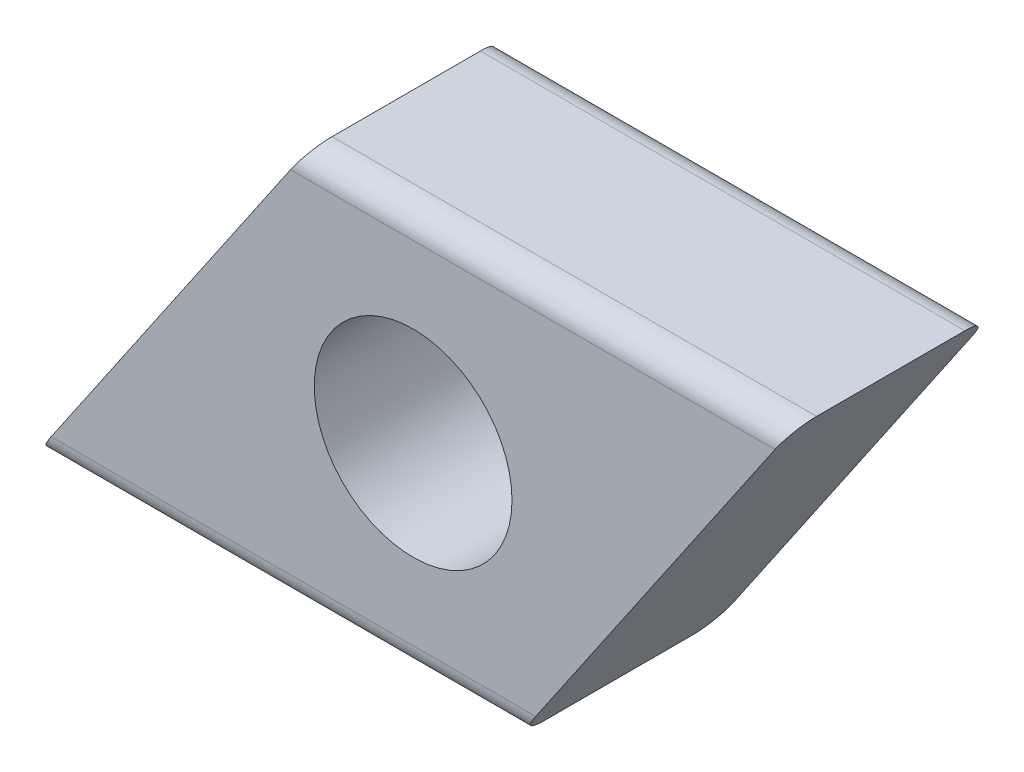
ISO-10303-21;
HEADER;
FILE_DESCRIPTION(('STEP AP214'),'2;1');
FILE_NAME('part.step','',(''),(''),'','','');
FILE_SCHEMA(('AUTOMOTIVE_DESIGN { 1 0 10303 214 1 1 1 1 }'));
ENDSEC;
DATA;
#1=APPLICATION_CONTEXT('core data for automotive mechanical design processes');
#2=APPLICATION_PROTOCOL_DEFINITION('international standard','automotive_design',2000,#1);
#3=PRODUCT_CONTEXT('',#1,'mechanical');
#4=PRODUCT('Part','Part','',(#3));
#5=PRODUCT_RELATED_PRODUCT_CATEGORY('part','',(#4));
#6=PRODUCT_DEFINITION_FORMATION('','',#4);
#7=PRODUCT_DEFINITION_CONTEXT('part definition',#1,'design');
#8=PRODUCT_DEFINITION('design','',#6,#7);
#9=PRODUCT_DEFINITION_SHAPE('','',#8);
#10=(LENGTH_UNIT() NAMED_UNIT(*) SI_UNIT(.MILLI.,.METRE.));
#11=(NAMED_UNIT(*) PLANE_ANGLE_UNIT() SI_UNIT($,.RADIAN.));
#12=(NAMED_UNIT(*) SI_UNIT($,.STERADIAN.) SOLID_ANGLE_UNIT());
#13=UNCERTAINTY_MEASURE_WITH_UNIT(LENGTH_MEASURE(1.E-05),#10,'distance_accuracy_value','');
#14=(GEOMETRIC_REPRESENTATION_CONTEXT(3) GLOBAL_UNCERTAINTY_ASSIGNED_CONTEXT((#13)) GLOBAL_UNIT_ASSIGNED_CONTEXT((#10,
#11,#12)) REPRESENTATION_CONTEXT('',''));
#15=CARTESIAN_POINT('',(0.,0.,0.));
#16=DIRECTION('',(0.,0.,1.));
#17=DIRECTION('',(1.,0.,0.));
#18=AXIS2_PLACEMENT_3D('',#15,#16,#17);
#19=CARTESIAN_POINT('',(0.,0.,4.));
#20=DIRECTION('',(0.826146788634578,-0.563454952617132,0.));
#21=DIRECTION('',(0.563454952617132,0.826146788634578,0.));
#22=AXIS2_PLACEMENT_3D('',#19,#20,#21);
#23=PLANE('',#22);
#24=DIRECTION('',(0.,0.,-1.));
#25=VECTOR('',#24,1.);
#26=CARTESIAN_POINT('',(5.52185853564789,8.09623852861886,4.));
#27=LINE('',#26,#25);
#28=CARTESIAN_POINT('',(5.52185853564789,8.09623852861886,3.5));
#29=VERTEX_POINT('',#28);
#30=CARTESIAN_POINT('',(5.52185853564789,8.09623852861886,0.5));
#31=VERTEX_POINT('',#30);
#32=EDGE_CURVE('E99',#29,#31,#27,.T.);
#33=ORIENTED_EDGE('',*,*,#32,.T.);
#34=CARTESIAN_POINT('',(5.1808447107631,7.59623852861886,0.5));
#35=DIRECTION('',(0.826146788634578,-0.563454952617132,0.));
#36=DIRECTION('',(0.563454952617132,0.826146788634578,0.));
#37=AXIS2_PLACEMENT_3D('',#34,#35,#36);
#38=ELLIPSE('',#37,0.605219322859537,0.5);
#39=CARTESIAN_POINT('',(5.1808447107631,7.59623852861886,0.));
#40=VERTEX_POINT('',#39);
#41=EDGE_CURVE('E106',#31,#40,#38,.F.);
#42=ORIENTED_EDGE('',*,*,#41,.T.);
#43=DIRECTION('',(-0.563454952617132,-0.826146788634578,0.));
#44=VECTOR('',#43,1.);
#45=CARTESIAN_POINT('',(0.,0.,0.));
#46=LINE('',#45,#44);
#47=CARTESIAN_POINT('',(0.341013824884793,0.5,0.));
#48=VERTEX_POINT('',#47);
#49=EDGE_CURVE('E167',#40,#48,#46,.T.);
#50=ORIENTED_EDGE('',*,*,#49,.T.);
#51=CARTESIAN_POINT('',(0.341013824884793,0.5,0.5));
#52=DIRECTION('',(0.826146788634578,-0.563454952617132,0.));
#53=DIRECTION('',(-0.563454952617132,-0.826146788634578,0.));
#54=AXIS2_PLACEMENT_3D('',#51,#52,#53);
#55=ELLIPSE('',#54,0.605219322859537,0.5);
#56=CARTESIAN_POINT('',(0.,0.,0.5));
#57=VERTEX_POINT('',#56);
#58=EDGE_CURVE('E107',#48,#57,#55,.F.);
#59=ORIENTED_EDGE('',*,*,#58,.T.);
#60=DIRECTION('',(0.,0.,-1.));
#61=VECTOR('',#60,1.);
#62=CARTESIAN_POINT('',(0.,0.,4.));
#63=LINE('',#62,#61);
#64=CARTESIAN_POINT('',(0.,0.,3.5));
#65=VERTEX_POINT('',#64);
#66=EDGE_CURVE('E123',#65,#57,#63,.T.);
#67=ORIENTED_EDGE('',*,*,#66,.F.);
#68=CARTESIAN_POINT('',(0.341013824884794,0.5,3.5));
#69=DIRECTION('',(0.826146788634578,-0.563454952617132,0.));
#70=DIRECTION('',(0.563454952617132,0.826146788634578,0.));
#71=AXIS2_PLACEMENT_3D('',#68,#69,#70);
#72=ELLIPSE('',#71,0.605219322859537,0.5);
#73=CARTESIAN_POINT('',(0.341013824884793,0.500000000000001,4.));
#74=VERTEX_POINT('',#73);
#75=EDGE_CURVE('E125',#65,#74,#72,.F.);
#76=ORIENTED_EDGE('',*,*,#75,.T.);
#77=DIRECTION('',(-0.563454952617132,-0.826146788634578,0.));
#78=VECTOR('',#77,1.);
#79=CARTESIAN_POINT('',(0.,0.,4.));
#80=LINE('',#79,#78);
#81=CARTESIAN_POINT('',(5.1808447107631,7.59623852861886,4.));
#82=VERTEX_POINT('',#81);
#83=EDGE_CURVE('E101',#82,#74,#80,.T.);
#84=ORIENTED_EDGE('',*,*,#83,.F.);
#85=CARTESIAN_POINT('',(5.1808447107631,7.59623852861886,3.5));
#86=DIRECTION('',(0.826146788634578,-0.563454952617132,0.));
#87=DIRECTION('',(-0.563454952617132,-0.826146788634578,0.));
#88=AXIS2_PLACEMENT_3D('',#85,#86,#87);
#89=ELLIPSE('',#88,0.605219322859537,0.5);
#90=EDGE_CURVE('E97',#82,#29,#89,.F.);
#91=ORIENTED_EDGE('',*,*,#90,.T.);
#92=EDGE_LOOP('',(#33,#42,#50,#59,#67,#76,#84,#91));
#93=FACE_BOUND('',#92,.T.);
#94=ADVANCED_FACE('F31',(#93),#23,.F.);
#95=CARTESIAN_POINT('',(0.,0.,4.));
#96=DIRECTION('',(0.,1.,0.));
#97=DIRECTION('',(0.,0.,1.));
#98=AXIS2_PLACEMENT_3D('',#95,#96,#97);
#99=PLANE('',#98);
#100=ORIENTED_EDGE('',*,*,#66,.T.);
#101=DIRECTION('',(1.,0.,0.));
#102=VECTOR('',#101,1.);
#103=CARTESIAN_POINT('',(9.8,0.,0.5));
#104=LINE('',#103,#102);
#105=CARTESIAN_POINT('',(9.8,0.,0.5));
#106=VERTEX_POINT('',#105);
#107=EDGE_CURVE('E11',#57,#106,#104,.T.);
#108=ORIENTED_EDGE('',*,*,#107,.T.);
#109=DIRECTION('',(0.,0.,-1.));
#110=VECTOR('',#109,1.);
#111=CARTESIAN_POINT('',(9.8,0.,4.));
#112=LINE('',#111,#110);
#113=CARTESIAN_POINT('',(9.8,0.,3.5));
#114=VERTEX_POINT('',#113);
#115=EDGE_CURVE('E128',#114,#106,#112,.T.);
#116=ORIENTED_EDGE('',*,*,#115,.F.);
#117=DIRECTION('',(1.,0.,0.));
#118=VECTOR('',#117,1.);
#119=CARTESIAN_POINT('',(0.,0.,3.5));
#120=LINE('',#119,#118);
#121=EDGE_CURVE('E39',#114,#65,#120,.F.);
#122=ORIENTED_EDGE('',*,*,#121,.T.);
#123=EDGE_LOOP('',(#100,#108,#116,#122));
#124=FACE_BOUND('',#123,.T.);
#125=ADVANCED_FACE('F151',(#124),#99,.F.);
#126=CARTESIAN_POINT('',(9.8,0.,4.));
#127=DIRECTION('',(-0.826146788634578,0.563454952617132,0.));
#128=DIRECTION('',(-0.563454952617132,-0.826146788634578,0.));
#129=AXIS2_PLACEMENT_3D('',#126,#127,#128);
#130=PLANE('',#129);
#131=DIRECTION('',(0.563454952617132,0.826146788634578,0.));
#132=VECTOR('',#131,1.);
#133=CARTESIAN_POINT('',(9.8,0.,0.));
#134=LINE('',#133,#132);
#135=CARTESIAN_POINT('',(10.1410138248848,0.5,0.));
#136=VERTEX_POINT('',#135);
#137=CARTESIAN_POINT('',(14.9808447107631,7.59623852861886,0.));
#138=VERTEX_POINT('',#137);
#139=EDGE_CURVE('E163',#136,#138,#134,.T.);
#140=ORIENTED_EDGE('',*,*,#139,.T.);
#141=CARTESIAN_POINT('',(14.9808447107631,7.59623852861886,0.5));
#142=DIRECTION('',(-0.826146788634578,0.563454952617132,0.));
#143=DIRECTION('',(0.563454952617132,0.826146788634578,0.));
#144=AXIS2_PLACEMENT_3D('',#141,#142,#143);
#145=ELLIPSE('',#144,0.605219322859537,0.5);
#146=CARTESIAN_POINT('',(15.3218585356479,8.09623852861886,0.5));
#147=VERTEX_POINT('',#146);
#148=EDGE_CURVE('E142',#138,#147,#145,.F.);
#149=ORIENTED_EDGE('',*,*,#148,.T.);
#150=DIRECTION('',(0.,0.,-1.));
#151=VECTOR('',#150,1.);
#152=CARTESIAN_POINT('',(15.3218585356479,8.09623852861886,4.));
#153=LINE('',#152,#151);
#154=CARTESIAN_POINT('',(15.3218585356479,8.09623852861886,3.5));
#155=VERTEX_POINT('',#154);
#156=EDGE_CURVE('E117',#155,#147,#153,.T.);
#157=ORIENTED_EDGE('',*,*,#156,.F.);
#158=CARTESIAN_POINT('',(14.9808447107631,7.59623852861886,3.5));
#159=DIRECTION('',(-0.826146788634578,0.563454952617132,0.));
#160=DIRECTION('',(-0.563454952617132,-0.826146788634578,0.));
#161=AXIS2_PLACEMENT_3D('',#158,#159,#160);
#162=ELLIPSE('',#161,0.605219322859537,0.5);
#163=CARTESIAN_POINT('',(14.9808447107631,7.59623852861886,4.));
#164=VERTEX_POINT('',#163);
#165=EDGE_CURVE('E122',#155,#164,#162,.F.);
#166=ORIENTED_EDGE('',*,*,#165,.T.);
#167=DIRECTION('',(0.563454952617132,0.826146788634578,0.));
#168=VECTOR('',#167,1.);
#169=CARTESIAN_POINT('',(9.8,0.,4.));
#170=LINE('',#169,#168);
#171=CARTESIAN_POINT('',(10.1410138248848,0.500000000000001,4.));
#172=VERTEX_POINT('',#171);
#173=EDGE_CURVE('E118',#172,#164,#170,.T.);
#174=ORIENTED_EDGE('',*,*,#173,.F.);
#175=CARTESIAN_POINT('',(10.1410138248848,0.5,3.5));
#176=DIRECTION('',(-0.826146788634578,0.563454952617132,0.));
#177=DIRECTION('',(0.563454952617132,0.826146788634578,0.));
#178=AXIS2_PLACEMENT_3D('',#175,#176,#177);
#179=ELLIPSE('',#178,0.605219322859537,0.5);
#180=EDGE_CURVE('E53',#172,#114,#179,.F.);
#181=ORIENTED_EDGE('',*,*,#180,.T.);
#182=ORIENTED_EDGE('',*,*,#115,.T.);
#183=CARTESIAN_POINT('',(10.1410138248848,0.5,0.5));
#184=DIRECTION('',(-0.826146788634578,0.563454952617132,0.));
#185=DIRECTION('',(-0.563454952617132,-0.826146788634578,0.));
#186=AXIS2_PLACEMENT_3D('',#183,#184,#185);
#187=ELLIPSE('',#186,0.605219322859537,0.5);
#188=EDGE_CURVE('E46',#106,#136,#187,.F.);
#189=ORIENTED_EDGE('',*,*,#188,.T.);
#190=EDGE_LOOP('',(#140,#149,#157,#166,#174,#181,#182,#189));
#191=FACE_BOUND('',#190,.T.);
#192=ADVANCED_FACE('F161',(#191),#130,.F.);
#193=CARTESIAN_POINT('',(5.52185853564789,8.09623852861886,4.));
#194=DIRECTION('',(0.,-1.,0.));
#195=DIRECTION('',(0.,0.,-1.));
#196=AXIS2_PLACEMENT_3D('',#193,#194,#195);
#197=PLANE('',#196);
#198=ORIENTED_EDGE('',*,*,#156,.T.);
#199=DIRECTION('',(-1.,0.,0.));
#200=VECTOR('',#199,1.);
#201=CARTESIAN_POINT('',(5.52185853564789,8.09623852861886,0.5));
#202=LINE('',#201,#200);
#203=EDGE_CURVE('E116',#147,#31,#202,.T.);
#204=ORIENTED_EDGE('',*,*,#203,.T.);
#205=ORIENTED_EDGE('',*,*,#32,.F.);
#206=DIRECTION('',(-1.,0.,0.));
#207=VECTOR('',#206,1.);
#208=CARTESIAN_POINT('',(5.52185853564789,8.09623852861886,3.5));
#209=LINE('',#208,#207);
#210=EDGE_CURVE('E113',#29,#155,#209,.F.);
#211=ORIENTED_EDGE('',*,*,#210,.T.);
#212=EDGE_LOOP('',(#198,#204,#205,#211));
#213=FACE_BOUND('',#212,.T.);
#214=ADVANCED_FACE('F112',(#213),#197,.F.);
#215=CARTESIAN_POINT('',(5.52185853564789,8.09623852861886,4.));
#216=DIRECTION('',(0.,0.,-1.));
#217=DIRECTION('',(-1.,0.,0.));
#218=AXIS2_PLACEMENT_3D('',#215,#216,#217);
#219=PLANE('',#218);
#220=CARTESIAN_POINT('',(7.66092926782395,4.04811926430943,4.));
#221=DIRECTION('',(0.,0.,1.));
#222=DIRECTION('',(1.,0.,0.));
#223=AXIS2_PLACEMENT_3D('',#220,#221,#222);
#224=CIRCLE('',#223,2.);
#225=CARTESIAN_POINT('',(9.66092926782395,4.04811926430943,4.));
#226=VERTEX_POINT('',#225);
#227=EDGE_CURVE('E274',#226,#226,#224,.T.);
#228=ORIENTED_EDGE('',*,*,#227,.F.);
#229=EDGE_LOOP('',(#228));
#230=FACE_BOUND('',#229,.T.);
#231=ORIENTED_EDGE('',*,*,#173,.T.);
#232=DIRECTION('',(-1.,0.,0.));
#233=VECTOR('',#232,1.);
#234=CARTESIAN_POINT('',(5.52185853564789,7.59623852861886,4.));
#235=LINE('',#234,#233);
#236=EDGE_CURVE('E147',#164,#82,#235,.T.);
#237=ORIENTED_EDGE('',*,*,#236,.T.);
#238=ORIENTED_EDGE('',*,*,#83,.T.);
#239=DIRECTION('',(1.,0.,0.));
#240=VECTOR('',#239,1.);
#241=CARTESIAN_POINT('',(5.52185853564789,0.5,4.));
#242=LINE('',#241,#240);
#243=EDGE_CURVE('E144',#74,#172,#242,.T.);
#244=ORIENTED_EDGE('',*,*,#243,.T.);
#245=EDGE_LOOP('',(#231,#237,#238,#244));
#246=FACE_BOUND('',#245,.T.);
#247=ADVANCED_FACE('F159',(#230,#246),#219,.F.);
#248=CARTESIAN_POINT('',(5.52185853564789,8.09623852861886,0.));
#249=DIRECTION('',(0.,0.,-1.));
#250=DIRECTION('',(-1.,0.,0.));
#251=AXIS2_PLACEMENT_3D('',#248,#249,#250);
#252=PLANE('',#251);
#253=CARTESIAN_POINT('',(7.66092926782395,4.04811926430943,0.));
#254=DIRECTION('',(0.,0.,1.));
#255=DIRECTION('',(1.,0.,0.));
#256=AXIS2_PLACEMENT_3D('',#253,#254,#255);
#257=CIRCLE('',#256,2.);
#258=CARTESIAN_POINT('',(9.66092926782395,4.04811926430943,0.));
#259=VERTEX_POINT('',#258);
#260=EDGE_CURVE('E169',#259,#259,#257,.T.);
#261=ORIENTED_EDGE('',*,*,#260,.T.);
#262=EDGE_LOOP('',(#261));
#263=FACE_BOUND('',#262,.T.);
#264=ORIENTED_EDGE('',*,*,#49,.F.);
#265=DIRECTION('',(-1.,0.,0.));
#266=VECTOR('',#265,1.);
#267=CARTESIAN_POINT('',(15.3218585356479,7.59623852861886,0.));
#268=LINE('',#267,#266);
#269=EDGE_CURVE('E137',#40,#138,#268,.F.);
#270=ORIENTED_EDGE('',*,*,#269,.T.);
#271=ORIENTED_EDGE('',*,*,#139,.F.);
#272=DIRECTION('',(1.,0.,0.));
#273=VECTOR('',#272,1.);
#274=CARTESIAN_POINT('',(0.,0.5,0.));
#275=LINE('',#274,#273);
#276=EDGE_CURVE('E135',#136,#48,#275,.F.);
#277=ORIENTED_EDGE('',*,*,#276,.T.);
#278=EDGE_LOOP('',(#264,#270,#271,#277));
#279=FACE_BOUND('',#278,.T.);
#280=ADVANCED_FACE('F175',(#263,#279),#252,.T.);
#281=CARTESIAN_POINT('',(7.66092926782395,4.04811926430943,0.));
#282=DIRECTION('',(0.,0.,1.));
#283=DIRECTION('',(1.,0.,0.));
#284=AXIS2_PLACEMENT_3D('',#281,#282,#283);
#285=CYLINDRICAL_SURFACE('',#284,2.);
#286=ORIENTED_EDGE('',*,*,#260,.F.);
#287=EDGE_LOOP('',(#286));
#288=FACE_BOUND('',#287,.T.);
#289=ORIENTED_EDGE('',*,*,#227,.T.);
#290=EDGE_LOOP('',(#289));
#291=FACE_BOUND('',#290,.T.);
#292=ADVANCED_FACE('F194',(#288,#291),#285,.F.);
#293=CARTESIAN_POINT('',(5.52185853564789,7.59623852861886,0.5));
#294=DIRECTION('',(1.,0.,0.));
#295=DIRECTION('',(0.,0.,-1.));
#296=AXIS2_PLACEMENT_3D('',#293,#294,#295);
#297=CYLINDRICAL_SURFACE('',#296,0.5);
#298=ORIENTED_EDGE('',*,*,#148,.F.);
#299=ORIENTED_EDGE('',*,*,#269,.F.);
#300=ORIENTED_EDGE('',*,*,#41,.F.);
#301=ORIENTED_EDGE('',*,*,#203,.F.);
#302=EDGE_LOOP('',(#298,#299,#300,#301));
#303=FACE_BOUND('',#302,.T.);
#304=ADVANCED_FACE('F183',(#303),#297,.T.);
#305=CARTESIAN_POINT('',(5.52185853564789,7.59623852861886,3.5));
#306=DIRECTION('',(-1.,0.,0.));
#307=DIRECTION('',(0.,0.,1.));
#308=AXIS2_PLACEMENT_3D('',#305,#306,#307);
#309=CYLINDRICAL_SURFACE('',#308,0.5);
#310=ORIENTED_EDGE('',*,*,#165,.F.);
#311=ORIENTED_EDGE('',*,*,#210,.F.);
#312=ORIENTED_EDGE('',*,*,#90,.F.);
#313=ORIENTED_EDGE('',*,*,#236,.F.);
#314=EDGE_LOOP('',(#310,#311,#312,#313));
#315=FACE_BOUND('',#314,.T.);
#316=ADVANCED_FACE('F121',(#315),#309,.T.);
#317=CARTESIAN_POINT('',(0.,0.5,0.5));
#318=DIRECTION('',(-1.,0.,0.));
#319=DIRECTION('',(0.,0.,1.));
#320=AXIS2_PLACEMENT_3D('',#317,#318,#319);
#321=CYLINDRICAL_SURFACE('',#320,0.5);
#322=ORIENTED_EDGE('',*,*,#58,.F.);
#323=ORIENTED_EDGE('',*,*,#276,.F.);
#324=ORIENTED_EDGE('',*,*,#188,.F.);
#325=ORIENTED_EDGE('',*,*,#107,.F.);
#326=EDGE_LOOP('',(#322,#323,#324,#325));
#327=FACE_BOUND('',#326,.T.);
#328=ADVANCED_FACE('F177',(#327),#321,.T.);
#329=CARTESIAN_POINT('',(5.52185853564789,0.5,3.5));
#330=DIRECTION('',(1.,0.,0.));
#331=DIRECTION('',(0.,0.,-1.));
#332=AXIS2_PLACEMENT_3D('',#329,#330,#331);
#333=CYLINDRICAL_SURFACE('',#332,0.5);
#334=ORIENTED_EDGE('',*,*,#75,.F.);
#335=ORIENTED_EDGE('',*,*,#121,.F.);
#336=ORIENTED_EDGE('',*,*,#180,.F.);
#337=ORIENTED_EDGE('',*,*,#243,.F.);
#338=EDGE_LOOP('',(#334,#335,#336,#337));
#339=FACE_BOUND('',#338,.T.);
#340=ADVANCED_FACE('F33',(#339),#333,.T.);
#341=CLOSED_SHELL('',(#94,#125,#192,#214,#247,#280,#292,#304,#316,#328,#340));
#342=MANIFOLD_SOLID_BREP('B2',#341);
#343=ADVANCED_BREP_SHAPE_REPRESENTATION('',(#18,#342),#14);
#344=SHAPE_DEFINITION_REPRESENTATION(#9,#343);
ENDSEC;
END-ISO-10303-21;
